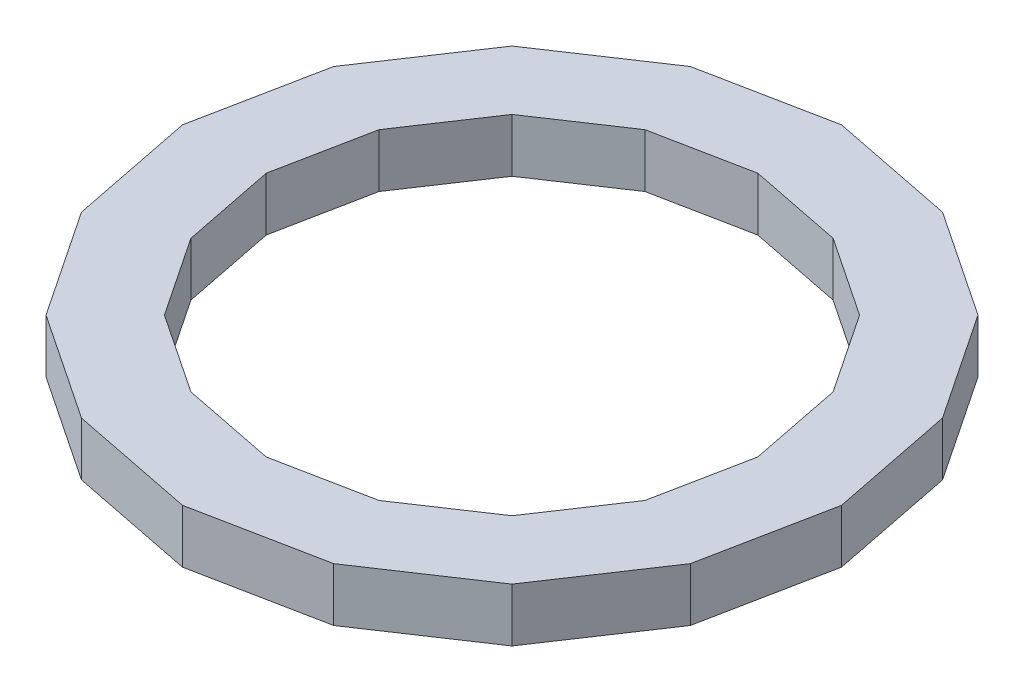
ISO-10303-21;
HEADER;
FILE_DESCRIPTION(('STEP AP214'),'2;1');
FILE_NAME('part.step','',(''),(''),'','','');
FILE_SCHEMA(('AUTOMOTIVE_DESIGN { 1 0 10303 214 1 1 1 1 }'));
ENDSEC;
DATA;
#1=APPLICATION_CONTEXT('core data for automotive mechanical design processes');
#2=APPLICATION_PROTOCOL_DEFINITION('international standard','automotive_design',2000,#1);
#3=PRODUCT_CONTEXT('',#1,'mechanical');
#4=PRODUCT('Part','Part','',(#3));
#5=PRODUCT_RELATED_PRODUCT_CATEGORY('part','',(#4));
#6=PRODUCT_DEFINITION_FORMATION('','',#4);
#7=PRODUCT_DEFINITION_CONTEXT('part definition',#1,'design');
#8=PRODUCT_DEFINITION('design','',#6,#7);
#9=PRODUCT_DEFINITION_SHAPE('','',#8);
#10=(LENGTH_UNIT() NAMED_UNIT(*) SI_UNIT(.MILLI.,.METRE.));
#11=(NAMED_UNIT(*) PLANE_ANGLE_UNIT() SI_UNIT($,.RADIAN.));
#12=(NAMED_UNIT(*) SI_UNIT($,.STERADIAN.) SOLID_ANGLE_UNIT());
#13=UNCERTAINTY_MEASURE_WITH_UNIT(LENGTH_MEASURE(1.E-05),#10,'distance_accuracy_value','');
#14=(GEOMETRIC_REPRESENTATION_CONTEXT(3) GLOBAL_UNCERTAINTY_ASSIGNED_CONTEXT((#13)) GLOBAL_UNIT_ASSIGNED_CONTEXT((#10,
#11,#12)) REPRESENTATION_CONTEXT('',''));
#15=CARTESIAN_POINT('',(0.,0.,0.));
#16=DIRECTION('',(0.,0.,1.));
#17=DIRECTION('',(1.,0.,0.));
#18=AXIS2_PLACEMENT_3D('',#15,#16,#17);
#19=CARTESIAN_POINT('',(0.,19.05,0.));
#20=DIRECTION('',(0.,1.,0.));
#21=DIRECTION('',(0.,0.,1.));
#22=AXIS2_PLACEMENT_3D('',#19,#20,#21);
#23=PLANE('',#22);
#24=DIRECTION('',(0.195090322016118,0.,-0.980785280403233));
#25=VECTOR('',#24,1.);
#26=CARTESIAN_POINT('',(108.256964748165,19.05,44.8415030200346));
#27=LINE('',#26,#25);
#28=CARTESIAN_POINT('',(108.256964748165,19.05,44.8415030200346));
#29=VERTEX_POINT('',#28);
#30=CARTESIAN_POINT('',(117.176494270742,19.05,-1.2836898412475E-12));
#31=VERTEX_POINT('',#30);
#32=EDGE_CURVE('E380',#29,#31,#27,.T.);
#33=ORIENTED_EDGE('',*,*,#32,.T.);
#34=DIRECTION('',(-0.195090322016139,0.,-0.980785280403228));
#35=VECTOR('',#34,1.);
#36=CARTESIAN_POINT('',(117.176494270742,19.05,-1.2836898412475E-12));
#37=LINE('',#36,#35);
#38=CARTESIAN_POINT('',(108.256964748164,19.05,-44.8415030200369));
#39=VERTEX_POINT('',#38);
#40=EDGE_CURVE('E383',#31,#39,#37,.T.);
#41=ORIENTED_EDGE('',*,*,#40,.T.);
#42=DIRECTION('',(-0.555570233019611,0.,-0.831469612302539));
#43=VECTOR('',#42,1.);
#44=CARTESIAN_POINT('',(108.256964748164,19.05,-44.8415030200369));
#45=LINE('',#44,#43);
#46=CARTESIAN_POINT('',(82.8562936945072,19.05,-82.856293694509));
#47=VERTEX_POINT('',#46);
#48=EDGE_CURVE('E386',#39,#47,#45,.T.);
#49=ORIENTED_EDGE('',*,*,#48,.T.);
#50=DIRECTION('',(-0.831469612302551,0.,-0.555570233019593));
#51=VECTOR('',#50,1.);
#52=CARTESIAN_POINT('',(82.8562936945072,19.05,-82.856293694509));
#53=LINE('',#52,#51);
#54=CARTESIAN_POINT('',(44.8415030200347,19.05,-108.256964748165));
#55=VERTEX_POINT('',#54);
#56=EDGE_CURVE('E388',#47,#55,#53,.T.);
#57=ORIENTED_EDGE('',*,*,#56,.T.);
#58=DIRECTION('',(-0.980785280403233,0.,-0.195090322016118));
#59=VECTOR('',#58,1.);
#60=CARTESIAN_POINT('',(44.8415030200347,19.05,-108.256964748165));
#61=LINE('',#60,#59);
#62=CARTESIAN_POINT('',(-1.23500220557387E-12,19.05,-117.176494270742));
#63=VERTEX_POINT('',#62);
#64=EDGE_CURVE('E391',#55,#63,#61,.T.);
#65=ORIENTED_EDGE('',*,*,#64,.T.);
#66=DIRECTION('',(-0.980785280403228,0.,0.195090322016139));
#67=VECTOR('',#66,1.);
#68=CARTESIAN_POINT('',(-1.23500220557387E-12,19.05,-117.176494270742));
#69=LINE('',#68,#67);
#70=CARTESIAN_POINT('',(-44.8415030200369,19.05,-108.256964748164));
#71=VERTEX_POINT('',#70);
#72=EDGE_CURVE('E394',#63,#71,#69,.T.);
#73=ORIENTED_EDGE('',*,*,#72,.T.);
#74=DIRECTION('',(-0.831469612302539,0.,0.555570233019611));
#75=VECTOR('',#74,1.);
#76=CARTESIAN_POINT('',(-44.8415030200369,19.05,-108.256964748164));
#77=LINE('',#76,#75);
#78=CARTESIAN_POINT('',(-82.856293694509,19.05,-82.8562936945072));
#79=VERTEX_POINT('',#78);
#80=EDGE_CURVE('E396',#71,#79,#77,.T.);
#81=ORIENTED_EDGE('',*,*,#80,.T.);
#82=DIRECTION('',(-0.555570233019593,0.,0.831469612302551));
#83=VECTOR('',#82,1.);
#84=CARTESIAN_POINT('',(-82.856293694509,19.05,-82.8562936945072));
#85=LINE('',#84,#83);
#86=CARTESIAN_POINT('',(-108.256964748165,19.05,-44.8415030200345));
#87=VERTEX_POINT('',#86);
#88=EDGE_CURVE('E398',#79,#87,#85,.T.);
#89=ORIENTED_EDGE('',*,*,#88,.T.);
#90=DIRECTION('',(-0.195090322016118,0.,0.980785280403233));
#91=VECTOR('',#90,1.);
#92=CARTESIAN_POINT('',(-108.256964748165,19.05,-44.8415030200345));
#93=LINE('',#92,#91);
#94=CARTESIAN_POINT('',(-117.176494270742,19.05,1.25593425093567E-12));
#95=VERTEX_POINT('',#94);
#96=EDGE_CURVE('E400',#87,#95,#93,.T.);
#97=ORIENTED_EDGE('',*,*,#96,.T.);
#98=DIRECTION('',(0.195090322016139,0.,0.980785280403228));
#99=VECTOR('',#98,1.);
#100=CARTESIAN_POINT('',(-117.176494270742,19.05,1.25593425093567E-12));
#101=LINE('',#100,#99);
#102=CARTESIAN_POINT('',(-108.256964748164,19.05,44.8415030200368));
#103=VERTEX_POINT('',#102);
#104=EDGE_CURVE('E402',#95,#103,#101,.T.);
#105=ORIENTED_EDGE('',*,*,#104,.T.);
#106=DIRECTION('',(0.555570233019611,0.,0.831469612302539));
#107=VECTOR('',#106,1.);
#108=CARTESIAN_POINT('',(-108.256964748164,19.05,44.8415030200368));
#109=LINE('',#108,#107);
#110=CARTESIAN_POINT('',(-82.8562936945072,19.05,82.8562936945089));
#111=VERTEX_POINT('',#110);
#112=EDGE_CURVE('E404',#103,#111,#109,.T.);
#113=ORIENTED_EDGE('',*,*,#112,.T.);
#114=DIRECTION('',(0.831469612302551,0.,0.555570233019594));
#115=VECTOR('',#114,1.);
#116=CARTESIAN_POINT('',(-82.8562936945072,19.05,82.8562936945089));
#117=LINE('',#116,#115);
#118=CARTESIAN_POINT('',(-44.8415030200346,19.05,108.256964748165));
#119=VERTEX_POINT('',#118);
#120=EDGE_CURVE('E406',#111,#119,#117,.T.);
#121=ORIENTED_EDGE('',*,*,#120,.T.);
#122=DIRECTION('',(0.980785280403232,0.,0.195090322016118));
#123=VECTOR('',#122,1.);
#124=CARTESIAN_POINT('',(-44.8415030200346,19.05,108.256964748165));
#125=LINE('',#124,#123);
#126=CARTESIAN_POINT('',(1.2390089246743E-12,19.05,117.176494270742));
#127=VERTEX_POINT('',#126);
#128=EDGE_CURVE('E408',#119,#127,#125,.T.);
#129=ORIENTED_EDGE('',*,*,#128,.T.);
#130=DIRECTION('',(0.980785280403228,0.,-0.195090322016139));
#131=VECTOR('',#130,1.);
#132=CARTESIAN_POINT('',(1.2390089246743E-12,19.05,117.176494270742));
#133=LINE('',#132,#131);
#134=CARTESIAN_POINT('',(44.8415030200369,19.05,108.256964748164));
#135=VERTEX_POINT('',#134);
#136=EDGE_CURVE('E410',#127,#135,#133,.T.);
#137=ORIENTED_EDGE('',*,*,#136,.T.);
#138=DIRECTION('',(0.831469612302539,0.,-0.555570233019611));
#139=VECTOR('',#138,1.);
#140=CARTESIAN_POINT('',(44.8415030200369,19.05,108.256964748164));
#141=LINE('',#140,#139);
#142=CARTESIAN_POINT('',(82.8562936945089,19.05,82.8562936945072));
#143=VERTEX_POINT('',#142);
#144=EDGE_CURVE('E412',#135,#143,#141,.T.);
#145=ORIENTED_EDGE('',*,*,#144,.T.);
#146=DIRECTION('',(0.555570233019593,0.,-0.831469612302551));
#147=VECTOR('',#146,1.);
#148=CARTESIAN_POINT('',(82.8562936945089,19.05,82.8562936945072));
#149=LINE('',#148,#147);
#150=EDGE_CURVE('E414',#143,#29,#149,.T.);
#151=ORIENTED_EDGE('',*,*,#150,.T.);
#152=EDGE_LOOP('',(#33,#41,#49,#57,#65,#73,#81,#89,#97,#105,#113,#121,#129,#137,#145,#151));
#153=FACE_BOUND('',#152,.T.);
#154=DIRECTION('',(-0.195090322016139,0.,-0.980785280403228));
#155=VECTOR('',#154,1.);
#156=CARTESIAN_POINT('',(87.3942365394767,19.05,-9.61078683792279E-13));
#157=LINE('',#156,#155);
#158=CARTESIAN_POINT('',(87.3942365394767,19.05,-9.61078683792279E-13));
#159=VERTEX_POINT('',#158);
#160=CARTESIAN_POINT('',(80.7417463982722,19.05,-33.4443264078544));
#161=VERTEX_POINT('',#160);
#162=EDGE_CURVE('E252',#159,#161,#157,.T.);
#163=ORIENTED_EDGE('',*,*,#162,.F.);
#164=DIRECTION('',(0.195090322016117,0.,-0.980785280403233));
#165=VECTOR('',#164,1.);
#166=CARTESIAN_POINT('',(80.741746398273,19.05,33.4443264078526));
#167=LINE('',#166,#165);
#168=CARTESIAN_POINT('',(80.741746398273,19.05,33.4443264078526));
#169=VERTEX_POINT('',#168);
#170=EDGE_CURVE('E244',#169,#159,#167,.T.);
#171=ORIENTED_EDGE('',*,*,#170,.F.);
#172=DIRECTION('',(0.555570233019594,0.,-0.831469612302551));
#173=VECTOR('',#172,1.);
#174=CARTESIAN_POINT('',(61.7970572936858,19.05,61.7970572936845));
#175=LINE('',#174,#173);
#176=CARTESIAN_POINT('',(61.7970572936858,19.05,61.7970572936845));
#177=VERTEX_POINT('',#176);
#178=EDGE_CURVE('E301',#177,#169,#175,.T.);
#179=ORIENTED_EDGE('',*,*,#178,.F.);
#180=DIRECTION('',(0.831469612302539,0.,-0.555570233019611));
#181=VECTOR('',#180,1.);
#182=CARTESIAN_POINT('',(33.4443264078544,19.05,80.7417463982722));
#183=LINE('',#182,#181);
#184=CARTESIAN_POINT('',(33.4443264078544,19.05,80.7417463982722));
#185=VERTEX_POINT('',#184);
#186=EDGE_CURVE('E298',#185,#177,#183,.T.);
#187=ORIENTED_EDGE('',*,*,#186,.F.);
#188=DIRECTION('',(0.980785280403228,0.,-0.195090322016139));
#189=VECTOR('',#188,1.);
#190=CARTESIAN_POINT('',(9.47666460703789E-13,19.05,87.3942365394767));
#191=LINE('',#190,#189);
#192=CARTESIAN_POINT('',(9.47666460703789E-13,19.05,87.3942365394767));
#193=VERTEX_POINT('',#192);
#194=EDGE_CURVE('E296',#193,#185,#191,.T.);
#195=ORIENTED_EDGE('',*,*,#194,.F.);
#196=DIRECTION('',(0.980785280403232,0.,0.195090322016118));
#197=VECTOR('',#196,1.);
#198=CARTESIAN_POINT('',(-33.4443264078526,19.05,80.7417463982729));
#199=LINE('',#198,#197);
#200=CARTESIAN_POINT('',(-33.4443264078526,19.05,80.7417463982729));
#201=VERTEX_POINT('',#200);
#202=EDGE_CURVE('E294',#201,#193,#199,.T.);
#203=ORIENTED_EDGE('',*,*,#202,.F.);
#204=DIRECTION('',(0.831469612302551,0.,0.555570233019593));
#205=VECTOR('',#204,1.);
#206=CARTESIAN_POINT('',(-61.7970572936845,19.05,61.7970572936858));
#207=LINE('',#206,#205);
#208=CARTESIAN_POINT('',(-61.7970572936845,19.05,61.7970572936858));
#209=VERTEX_POINT('',#208);
#210=EDGE_CURVE('E291',#209,#201,#207,.T.);
#211=ORIENTED_EDGE('',*,*,#210,.F.);
#212=DIRECTION('',(0.555570233019611,0.,0.831469612302539));
#213=VECTOR('',#212,1.);
#214=CARTESIAN_POINT('',(-80.7417463982722,19.05,33.4443264078543));
#215=LINE('',#214,#213);
#216=CARTESIAN_POINT('',(-80.7417463982722,19.05,33.4443264078543));
#217=VERTEX_POINT('',#216);
#218=EDGE_CURVE('E289',#217,#209,#215,.T.);
#219=ORIENTED_EDGE('',*,*,#218,.F.);
#220=DIRECTION('',(0.195090322016139,0.,0.980785280403228));
#221=VECTOR('',#220,1.);
#222=CARTESIAN_POINT('',(-87.3942365394767,19.05,9.88661870301204E-13));
#223=LINE('',#222,#221);
#224=CARTESIAN_POINT('',(-87.3942365394767,19.05,9.88661870301204E-13));
#225=VERTEX_POINT('',#224);
#226=EDGE_CURVE('E287',#225,#217,#223,.T.);
#227=ORIENTED_EDGE('',*,*,#226,.F.);
#228=DIRECTION('',(-0.195090322016118,0.,0.980785280403232));
#229=VECTOR('',#228,1.);
#230=CARTESIAN_POINT('',(-80.741746398273,19.05,-33.4443264078526));
#231=LINE('',#230,#229);
#232=CARTESIAN_POINT('',(-80.741746398273,19.05,-33.4443264078526));
#233=VERTEX_POINT('',#232);
#234=EDGE_CURVE('E285',#233,#225,#231,.T.);
#235=ORIENTED_EDGE('',*,*,#234,.F.);
#236=DIRECTION('',(-0.555570233019593,0.,0.831469612302551));
#237=VECTOR('',#236,1.);
#238=CARTESIAN_POINT('',(-61.7970572936858,19.05,-61.7970572936845));
#239=LINE('',#238,#237);
#240=CARTESIAN_POINT('',(-61.7970572936858,19.05,-61.7970572936845));
#241=VERTEX_POINT('',#240);
#242=EDGE_CURVE('E283',#241,#233,#239,.T.);
#243=ORIENTED_EDGE('',*,*,#242,.F.);
#244=DIRECTION('',(-0.831469612302539,0.,0.555570233019611));
#245=VECTOR('',#244,1.);
#246=CARTESIAN_POINT('',(-33.4443264078544,19.05,-80.7417463982722));
#247=LINE('',#246,#245);
#248=CARTESIAN_POINT('',(-33.4443264078544,19.05,-80.7417463982722));
#249=VERTEX_POINT('',#248);
#250=EDGE_CURVE('E281',#249,#241,#247,.T.);
#251=ORIENTED_EDGE('',*,*,#250,.F.);
#252=DIRECTION('',(-0.980785280403228,0.,0.195090322016139));
#253=VECTOR('',#252,1.);
#254=CARTESIAN_POINT('',(-9.54194750042065E-13,19.05,-87.3942365394767));
#255=LINE('',#254,#253);
#256=CARTESIAN_POINT('',(-9.54194750042065E-13,19.05,-87.3942365394767));
#257=VERTEX_POINT('',#256);
#258=EDGE_CURVE('E279',#257,#249,#255,.T.);
#259=ORIENTED_EDGE('',*,*,#258,.F.);
#260=DIRECTION('',(-0.980785280403232,0.,-0.195090322016118));
#261=VECTOR('',#260,1.);
#262=CARTESIAN_POINT('',(33.4443264078526,19.05,-80.741746398273));
#263=LINE('',#262,#261);
#264=CARTESIAN_POINT('',(33.4443264078526,19.05,-80.741746398273));
#265=VERTEX_POINT('',#264);
#266=EDGE_CURVE('E276',#265,#257,#263,.T.);
#267=ORIENTED_EDGE('',*,*,#266,.F.);
#268=DIRECTION('',(-0.831469612302551,0.,-0.555570233019593));
#269=VECTOR('',#268,1.);
#270=CARTESIAN_POINT('',(61.7970572936845,19.05,-61.7970572936858));
#271=LINE('',#270,#269);
#272=CARTESIAN_POINT('',(61.7970572936845,19.05,-61.7970572936858));
#273=VERTEX_POINT('',#272);
#274=EDGE_CURVE('E271',#273,#265,#271,.T.);
#275=ORIENTED_EDGE('',*,*,#274,.F.);
#276=DIRECTION('',(-0.555570233019611,0.,-0.831469612302539));
#277=VECTOR('',#276,1.);
#278=CARTESIAN_POINT('',(80.7417463982722,19.05,-33.4443264078544));
#279=LINE('',#278,#277);
#280=EDGE_CURVE('E265',#161,#273,#279,.T.);
#281=ORIENTED_EDGE('',*,*,#280,.F.);
#282=EDGE_LOOP('',(#163,#171,#179,#187,#195,#203,#211,#219,#227,#235,#243,#251,#259,#267,#275,#281));
#283=FACE_BOUND('',#282,.T.);
#284=ADVANCED_FACE('F35',(#153,#283),#23,.T.);
#285=CARTESIAN_POINT('',(0.,0.,0.));
#286=DIRECTION('',(0.,1.,0.));
#287=DIRECTION('',(0.,0.,1.));
#288=AXIS2_PLACEMENT_3D('',#285,#286,#287);
#289=PLANE('',#288);
#290=DIRECTION('',(0.195090322016118,0.,-0.980785280403233));
#291=VECTOR('',#290,1.);
#292=CARTESIAN_POINT('',(108.256964748165,0.,44.8415030200346));
#293=LINE('',#292,#291);
#294=CARTESIAN_POINT('',(108.256964748165,0.,44.8415030200346));
#295=VERTEX_POINT('',#294);
#296=CARTESIAN_POINT('',(117.176494270742,0.,-1.2836898412475E-12));
#297=VERTEX_POINT('',#296);
#298=EDGE_CURVE('E260',#295,#297,#293,.T.);
#299=ORIENTED_EDGE('',*,*,#298,.F.);
#300=DIRECTION('',(0.555570233019593,0.,-0.831469612302551));
#301=VECTOR('',#300,1.);
#302=CARTESIAN_POINT('',(82.8562936945089,0.,82.8562936945072));
#303=LINE('',#302,#301);
#304=CARTESIAN_POINT('',(82.8562936945089,0.,82.8562936945072));
#305=VERTEX_POINT('',#304);
#306=EDGE_CURVE('E384',#305,#295,#303,.T.);
#307=ORIENTED_EDGE('',*,*,#306,.F.);
#308=DIRECTION('',(0.831469612302539,0.,-0.555570233019611));
#309=VECTOR('',#308,1.);
#310=CARTESIAN_POINT('',(44.8415030200369,0.,108.256964748164));
#311=LINE('',#310,#309);
#312=CARTESIAN_POINT('',(44.8415030200369,0.,108.256964748164));
#313=VERTEX_POINT('',#312);
#314=EDGE_CURVE('E447',#313,#305,#311,.T.);
#315=ORIENTED_EDGE('',*,*,#314,.F.);
#316=DIRECTION('',(0.980785280403228,0.,-0.195090322016139));
#317=VECTOR('',#316,1.);
#318=CARTESIAN_POINT('',(1.2390089246743E-12,0.,117.176494270742));
#319=LINE('',#318,#317);
#320=CARTESIAN_POINT('',(1.2390089246743E-12,0.,117.176494270742));
#321=VERTEX_POINT('',#320);
#322=EDGE_CURVE('E445',#321,#313,#319,.T.);
#323=ORIENTED_EDGE('',*,*,#322,.F.);
#324=DIRECTION('',(0.980785280403232,0.,0.195090322016118));
#325=VECTOR('',#324,1.);
#326=CARTESIAN_POINT('',(-44.8415030200346,0.,108.256964748165));
#327=LINE('',#326,#325);
#328=CARTESIAN_POINT('',(-44.8415030200346,0.,108.256964748165));
#329=VERTEX_POINT('',#328);
#330=EDGE_CURVE('E443',#329,#321,#327,.T.);
#331=ORIENTED_EDGE('',*,*,#330,.F.);
#332=DIRECTION('',(0.831469612302551,0.,0.555570233019594));
#333=VECTOR('',#332,1.);
#334=CARTESIAN_POINT('',(-82.8562936945072,0.,82.8562936945089));
#335=LINE('',#334,#333);
#336=CARTESIAN_POINT('',(-82.8562936945072,0.,82.8562936945089));
#337=VERTEX_POINT('',#336);
#338=EDGE_CURVE('E441',#337,#329,#335,.T.);
#339=ORIENTED_EDGE('',*,*,#338,.F.);
#340=DIRECTION('',(0.555570233019611,0.,0.831469612302539));
#341=VECTOR('',#340,1.);
#342=CARTESIAN_POINT('',(-108.256964748164,0.,44.8415030200368));
#343=LINE('',#342,#341);
#344=CARTESIAN_POINT('',(-108.256964748164,0.,44.8415030200368));
#345=VERTEX_POINT('',#344);
#346=EDGE_CURVE('E439',#345,#337,#343,.T.);
#347=ORIENTED_EDGE('',*,*,#346,.F.);
#348=DIRECTION('',(0.195090322016139,0.,0.980785280403228));
#349=VECTOR('',#348,1.);
#350=CARTESIAN_POINT('',(-117.176494270742,0.,1.25593425093567E-12));
#351=LINE('',#350,#349);
#352=CARTESIAN_POINT('',(-117.176494270742,0.,1.25593425093567E-12));
#353=VERTEX_POINT('',#352);
#354=EDGE_CURVE('E437',#353,#345,#351,.T.);
#355=ORIENTED_EDGE('',*,*,#354,.F.);
#356=DIRECTION('',(-0.195090322016118,0.,0.980785280403233));
#357=VECTOR('',#356,1.);
#358=CARTESIAN_POINT('',(-108.256964748165,0.,-44.8415030200345));
#359=LINE('',#358,#357);
#360=CARTESIAN_POINT('',(-108.256964748165,0.,-44.8415030200345));
#361=VERTEX_POINT('',#360);
#362=EDGE_CURVE('E434',#361,#353,#359,.T.);
#363=ORIENTED_EDGE('',*,*,#362,.F.);
#364=DIRECTION('',(-0.555570233019593,0.,0.831469612302551));
#365=VECTOR('',#364,1.);
#366=CARTESIAN_POINT('',(-82.856293694509,0.,-82.8562936945072));
#367=LINE('',#366,#365);
#368=CARTESIAN_POINT('',(-82.856293694509,0.,-82.8562936945072));
#369=VERTEX_POINT('',#368);
#370=EDGE_CURVE('E432',#369,#361,#367,.T.);
#371=ORIENTED_EDGE('',*,*,#370,.F.);
#372=DIRECTION('',(-0.831469612302539,0.,0.555570233019611));
#373=VECTOR('',#372,1.);
#374=CARTESIAN_POINT('',(-44.8415030200369,0.,-108.256964748164));
#375=LINE('',#374,#373);
#376=CARTESIAN_POINT('',(-44.8415030200369,0.,-108.256964748164));
#377=VERTEX_POINT('',#376);
#378=EDGE_CURVE('E430',#377,#369,#375,.T.);
#379=ORIENTED_EDGE('',*,*,#378,.F.);
#380=DIRECTION('',(-0.980785280403228,0.,0.195090322016139));
#381=VECTOR('',#380,1.);
#382=CARTESIAN_POINT('',(-1.23500220557387E-12,0.,-117.176494270742));
#383=LINE('',#382,#381);
#384=CARTESIAN_POINT('',(-1.23500220557387E-12,0.,-117.176494270742));
#385=VERTEX_POINT('',#384);
#386=EDGE_CURVE('E428',#385,#377,#383,.T.);
#387=ORIENTED_EDGE('',*,*,#386,.F.);
#388=DIRECTION('',(-0.980785280403233,0.,-0.195090322016118));
#389=VECTOR('',#388,1.);
#390=CARTESIAN_POINT('',(44.8415030200347,0.,-108.256964748165));
#391=LINE('',#390,#389);
#392=CARTESIAN_POINT('',(44.8415030200347,0.,-108.256964748165));
#393=VERTEX_POINT('',#392);
#394=EDGE_CURVE('E426',#393,#385,#391,.T.);
#395=ORIENTED_EDGE('',*,*,#394,.F.);
#396=DIRECTION('',(-0.831469612302551,0.,-0.555570233019593));
#397=VECTOR('',#396,1.);
#398=CARTESIAN_POINT('',(82.8562936945072,0.,-82.856293694509));
#399=LINE('',#398,#397);
#400=CARTESIAN_POINT('',(82.8562936945072,0.,-82.856293694509));
#401=VERTEX_POINT('',#400);
#402=EDGE_CURVE('E423',#401,#393,#399,.T.);
#403=ORIENTED_EDGE('',*,*,#402,.F.);
#404=DIRECTION('',(-0.555570233019611,0.,-0.831469612302539));
#405=VECTOR('',#404,1.);
#406=CARTESIAN_POINT('',(108.256964748164,0.,-44.8415030200369));
#407=LINE('',#406,#405);
#408=CARTESIAN_POINT('',(108.256964748164,0.,-44.8415030200369));
#409=VERTEX_POINT('',#408);
#410=EDGE_CURVE('E421',#409,#401,#407,.T.);
#411=ORIENTED_EDGE('',*,*,#410,.F.);
#412=DIRECTION('',(-0.195090322016139,0.,-0.980785280403228));
#413=VECTOR('',#412,1.);
#414=CARTESIAN_POINT('',(117.176494270742,0.,-1.2836898412475E-12));
#415=LINE('',#414,#413);
#416=EDGE_CURVE('E419',#297,#409,#415,.T.);
#417=ORIENTED_EDGE('',*,*,#416,.F.);
#418=EDGE_LOOP('',(#299,#307,#315,#323,#331,#339,#347,#355,#363,#371,#379,#387,#395,#403,#411,#417));
#419=FACE_BOUND('',#418,.T.);
#420=DIRECTION('',(0.195090322016117,0.,-0.980785280403233));
#421=VECTOR('',#420,1.);
#422=CARTESIAN_POINT('',(80.741746398273,0.,33.4443264078526));
#423=LINE('',#422,#421);
#424=CARTESIAN_POINT('',(80.741746398273,0.,33.4443264078526));
#425=VERTEX_POINT('',#424);
#426=CARTESIAN_POINT('',(87.3942365394767,0.,-9.61078683792279E-13));
#427=VERTEX_POINT('',#426);
#428=EDGE_CURVE('E58',#425,#427,#423,.T.);
#429=ORIENTED_EDGE('',*,*,#428,.T.);
#430=DIRECTION('',(-0.195090322016139,0.,-0.980785280403228));
#431=VECTOR('',#430,1.);
#432=CARTESIAN_POINT('',(87.3942365394767,0.,-9.61078683792279E-13));
#433=LINE('',#432,#431);
#434=CARTESIAN_POINT('',(80.7417463982722,0.,-33.4443264078544));
#435=VERTEX_POINT('',#434);
#436=EDGE_CURVE('E259',#427,#435,#433,.T.);
#437=ORIENTED_EDGE('',*,*,#436,.T.);
#438=DIRECTION('',(-0.555570233019611,0.,-0.831469612302539));
#439=VECTOR('',#438,1.);
#440=CARTESIAN_POINT('',(80.7417463982722,0.,-33.4443264078544));
#441=LINE('',#440,#439);
#442=CARTESIAN_POINT('',(61.7970572936845,0.,-61.7970572936858));
#443=VERTEX_POINT('',#442);
#444=EDGE_CURVE('E306',#435,#443,#441,.T.);
#445=ORIENTED_EDGE('',*,*,#444,.T.);
#446=DIRECTION('',(-0.831469612302551,0.,-0.555570233019593));
#447=VECTOR('',#446,1.);
#448=CARTESIAN_POINT('',(61.7970572936845,0.,-61.7970572936858));
#449=LINE('',#448,#447);
#450=CARTESIAN_POINT('',(33.4443264078526,0.,-80.741746398273));
#451=VERTEX_POINT('',#450);
#452=EDGE_CURVE('E309',#443,#451,#449,.T.);
#453=ORIENTED_EDGE('',*,*,#452,.T.);
#454=DIRECTION('',(-0.980785280403232,0.,-0.195090322016118));
#455=VECTOR('',#454,1.);
#456=CARTESIAN_POINT('',(33.4443264078526,0.,-80.741746398273));
#457=LINE('',#456,#455);
#458=CARTESIAN_POINT('',(-9.54194750042065E-13,0.,-87.3942365394767));
#459=VERTEX_POINT('',#458);
#460=EDGE_CURVE('E313',#451,#459,#457,.T.);
#461=ORIENTED_EDGE('',*,*,#460,.T.);
#462=DIRECTION('',(-0.980785280403228,0.,0.195090322016139));
#463=VECTOR('',#462,1.);
#464=CARTESIAN_POINT('',(-9.54194750042065E-13,0.,-87.3942365394767));
#465=LINE('',#464,#463);
#466=CARTESIAN_POINT('',(-33.4443264078544,0.,-80.7417463982722));
#467=VERTEX_POINT('',#466);
#468=EDGE_CURVE('E316',#459,#467,#465,.T.);
#469=ORIENTED_EDGE('',*,*,#468,.T.);
#470=DIRECTION('',(-0.831469612302539,0.,0.555570233019611));
#471=VECTOR('',#470,1.);
#472=CARTESIAN_POINT('',(-33.4443264078544,0.,-80.7417463982722));
#473=LINE('',#472,#471);
#474=CARTESIAN_POINT('',(-61.7970572936858,0.,-61.7970572936845));
#475=VERTEX_POINT('',#474);
#476=EDGE_CURVE('E319',#467,#475,#473,.T.);
#477=ORIENTED_EDGE('',*,*,#476,.T.);
#478=DIRECTION('',(-0.555570233019593,0.,0.831469612302551));
#479=VECTOR('',#478,1.);
#480=CARTESIAN_POINT('',(-61.7970572936858,0.,-61.7970572936845));
#481=LINE('',#480,#479);
#482=CARTESIAN_POINT('',(-80.741746398273,0.,-33.4443264078526));
#483=VERTEX_POINT('',#482);
#484=EDGE_CURVE('E323',#475,#483,#481,.T.);
#485=ORIENTED_EDGE('',*,*,#484,.T.);
#486=DIRECTION('',(-0.195090322016118,0.,0.980785280403232));
#487=VECTOR('',#486,1.);
#488=CARTESIAN_POINT('',(-80.741746398273,0.,-33.4443264078526));
#489=LINE('',#488,#487);
#490=CARTESIAN_POINT('',(-87.3942365394767,0.,9.88661870301204E-13));
#491=VERTEX_POINT('',#490);
#492=EDGE_CURVE('E327',#483,#491,#489,.T.);
#493=ORIENTED_EDGE('',*,*,#492,.T.);
#494=DIRECTION('',(0.195090322016139,0.,0.980785280403228));
#495=VECTOR('',#494,1.);
#496=CARTESIAN_POINT('',(-87.3942365394767,0.,9.88661870301204E-13));
#497=LINE('',#496,#495);
#498=CARTESIAN_POINT('',(-80.7417463982722,0.,33.4443264078543));
#499=VERTEX_POINT('',#498);
#500=EDGE_CURVE('E330',#491,#499,#497,.T.);
#501=ORIENTED_EDGE('',*,*,#500,.T.);
#502=DIRECTION('',(0.555570233019611,0.,0.831469612302539));
#503=VECTOR('',#502,1.);
#504=CARTESIAN_POINT('',(-80.7417463982722,0.,33.4443264078543));
#505=LINE('',#504,#503);
#506=CARTESIAN_POINT('',(-61.7970572936845,0.,61.7970572936858));
#507=VERTEX_POINT('',#506);
#508=EDGE_CURVE('E333',#499,#507,#505,.T.);
#509=ORIENTED_EDGE('',*,*,#508,.T.);
#510=DIRECTION('',(0.831469612302551,0.,0.555570233019593));
#511=VECTOR('',#510,1.);
#512=CARTESIAN_POINT('',(-61.7970572936845,0.,61.7970572936858));
#513=LINE('',#512,#511);
#514=CARTESIAN_POINT('',(-33.4443264078526,0.,80.7417463982729));
#515=VERTEX_POINT('',#514);
#516=EDGE_CURVE('E337',#507,#515,#513,.T.);
#517=ORIENTED_EDGE('',*,*,#516,.T.);
#518=DIRECTION('',(0.980785280403232,0.,0.195090322016118));
#519=VECTOR('',#518,1.);
#520=CARTESIAN_POINT('',(-33.4443264078526,0.,80.7417463982729));
#521=LINE('',#520,#519);
#522=CARTESIAN_POINT('',(9.47666460703789E-13,0.,87.3942365394767));
#523=VERTEX_POINT('',#522);
#524=EDGE_CURVE('E340',#515,#523,#521,.T.);
#525=ORIENTED_EDGE('',*,*,#524,.T.);
#526=DIRECTION('',(0.980785280403228,0.,-0.195090322016139));
#527=VECTOR('',#526,1.);
#528=CARTESIAN_POINT('',(9.47666460703789E-13,0.,87.3942365394767));
#529=LINE('',#528,#527);
#530=CARTESIAN_POINT('',(33.4443264078544,0.,80.7417463982722));
#531=VERTEX_POINT('',#530);
#532=EDGE_CURVE('E343',#523,#531,#529,.T.);
#533=ORIENTED_EDGE('',*,*,#532,.T.);
#534=DIRECTION('',(0.831469612302539,0.,-0.555570233019611));
#535=VECTOR('',#534,1.);
#536=CARTESIAN_POINT('',(33.4443264078544,0.,80.7417463982722));
#537=LINE('',#536,#535);
#538=CARTESIAN_POINT('',(61.7970572936858,0.,61.7970572936845));
#539=VERTEX_POINT('',#538);
#540=EDGE_CURVE('E346',#531,#539,#537,.T.);
#541=ORIENTED_EDGE('',*,*,#540,.T.);
#542=DIRECTION('',(0.555570233019594,0.,-0.831469612302551));
#543=VECTOR('',#542,1.);
#544=CARTESIAN_POINT('',(61.7970572936858,0.,61.7970572936845));
#545=LINE('',#544,#543);
#546=EDGE_CURVE('E253',#539,#425,#545,.T.);
#547=ORIENTED_EDGE('',*,*,#546,.T.);
#548=EDGE_LOOP('',(#429,#437,#445,#453,#461,#469,#477,#485,#493,#501,#509,#517,#525,#533,#541,#547));
#549=FACE_BOUND('',#548,.T.);
#550=ADVANCED_FACE('F506',(#419,#549),#289,.F.);
#551=CARTESIAN_POINT('',(108.256964748165,19.05,44.8415030200346));
#552=DIRECTION('',(-0.980785280403232,0.,-0.195090322016118));
#553=DIRECTION('',(-0.195090322016118,0.,0.980785280403233));
#554=AXIS2_PLACEMENT_3D('',#551,#552,#553);
#555=PLANE('',#554);
#556=ORIENTED_EDGE('',*,*,#298,.T.);
#557=DIRECTION('',(0.,-1.,0.));
#558=VECTOR('',#557,1.);
#559=CARTESIAN_POINT('',(117.176494270742,19.05,-1.2836898412475E-12));
#560=LINE('',#559,#558);
#561=EDGE_CURVE('E11',#31,#297,#560,.T.);
#562=ORIENTED_EDGE('',*,*,#561,.F.);
#563=ORIENTED_EDGE('',*,*,#32,.F.);
#564=DIRECTION('',(0.,-1.,0.));
#565=VECTOR('',#564,1.);
#566=CARTESIAN_POINT('',(108.256964748165,19.05,44.8415030200346));
#567=LINE('',#566,#565);
#568=EDGE_CURVE('E416',#29,#295,#567,.T.);
#569=ORIENTED_EDGE('',*,*,#568,.T.);
#570=EDGE_LOOP('',(#556,#562,#563,#569));
#571=FACE_BOUND('',#570,.T.);
#572=ADVANCED_FACE('F37',(#571),#555,.F.);
#573=CARTESIAN_POINT('',(117.176494270742,19.05,-1.2836898412475E-12));
#574=DIRECTION('',(-0.980785280403228,0.,0.195090322016139));
#575=DIRECTION('',(0.195090322016139,0.,0.980785280403228));
#576=AXIS2_PLACEMENT_3D('',#573,#574,#575);
#577=PLANE('',#576);
#578=ORIENTED_EDGE('',*,*,#416,.T.);
#579=DIRECTION('',(0.,-1.,0.));
#580=VECTOR('',#579,1.);
#581=CARTESIAN_POINT('',(108.256964748164,19.05,-44.8415030200369));
#582=LINE('',#581,#580);
#583=EDGE_CURVE('E43',#39,#409,#582,.T.);
#584=ORIENTED_EDGE('',*,*,#583,.F.);
#585=ORIENTED_EDGE('',*,*,#40,.F.);
#586=ORIENTED_EDGE('',*,*,#561,.T.);
#587=EDGE_LOOP('',(#578,#584,#585,#586));
#588=FACE_BOUND('',#587,.T.);
#589=ADVANCED_FACE('F523',(#588),#577,.F.);
#590=CARTESIAN_POINT('',(108.256964748164,19.05,-44.8415030200369));
#591=DIRECTION('',(-0.831469612302539,0.,0.555570233019611));
#592=DIRECTION('',(0.555570233019611,0.,0.831469612302539));
#593=AXIS2_PLACEMENT_3D('',#590,#591,#592);
#594=PLANE('',#593);
#595=ORIENTED_EDGE('',*,*,#410,.T.);
#596=DIRECTION('',(0.,-1.,0.));
#597=VECTOR('',#596,1.);
#598=CARTESIAN_POINT('',(82.8562936945072,19.05,-82.856293694509));
#599=LINE('',#598,#597);
#600=EDGE_CURVE('E489',#47,#401,#599,.T.);
#601=ORIENTED_EDGE('',*,*,#600,.F.);
#602=ORIENTED_EDGE('',*,*,#48,.F.);
#603=ORIENTED_EDGE('',*,*,#583,.T.);
#604=EDGE_LOOP('',(#595,#601,#602,#603));
#605=FACE_BOUND('',#604,.T.);
#606=ADVANCED_FACE('F500',(#605),#594,.F.);
#607=CARTESIAN_POINT('',(82.8562936945072,19.05,-82.856293694509));
#608=DIRECTION('',(-0.555570233019593,0.,0.831469612302551));
#609=DIRECTION('',(0.831469612302551,0.,0.555570233019593));
#610=AXIS2_PLACEMENT_3D('',#607,#608,#609);
#611=PLANE('',#610);
#612=ORIENTED_EDGE('',*,*,#402,.T.);
#613=DIRECTION('',(0.,-1.,0.));
#614=VECTOR('',#613,1.);
#615=CARTESIAN_POINT('',(44.8415030200347,19.05,-108.256964748165));
#616=LINE('',#615,#614);
#617=EDGE_CURVE('E486',#55,#393,#616,.T.);
#618=ORIENTED_EDGE('',*,*,#617,.F.);
#619=ORIENTED_EDGE('',*,*,#56,.F.);
#620=ORIENTED_EDGE('',*,*,#600,.T.);
#621=EDGE_LOOP('',(#612,#618,#619,#620));
#622=FACE_BOUND('',#621,.T.);
#623=ADVANCED_FACE('F512',(#622),#611,.F.);
#624=CARTESIAN_POINT('',(44.8415030200347,19.05,-108.256964748165));
#625=DIRECTION('',(-0.195090322016118,0.,0.980785280403233));
#626=DIRECTION('',(0.980785280403233,0.,0.195090322016118));
#627=AXIS2_PLACEMENT_3D('',#624,#625,#626);
#628=PLANE('',#627);
#629=ORIENTED_EDGE('',*,*,#394,.T.);
#630=DIRECTION('',(0.,-1.,0.));
#631=VECTOR('',#630,1.);
#632=CARTESIAN_POINT('',(-1.23500220557387E-12,19.05,-117.176494270742));
#633=LINE('',#632,#631);
#634=EDGE_CURVE('E483',#63,#385,#633,.T.);
#635=ORIENTED_EDGE('',*,*,#634,.F.);
#636=ORIENTED_EDGE('',*,*,#64,.F.);
#637=ORIENTED_EDGE('',*,*,#617,.T.);
#638=EDGE_LOOP('',(#629,#635,#636,#637));
#639=FACE_BOUND('',#638,.T.);
#640=ADVANCED_FACE('F516',(#639),#628,.F.);
#641=CARTESIAN_POINT('',(-1.23500220557387E-12,19.05,-117.176494270742));
#642=DIRECTION('',(0.195090322016139,0.,0.980785280403228));
#643=DIRECTION('',(0.980785280403229,0.,-0.195090322016139));
#644=AXIS2_PLACEMENT_3D('',#641,#642,#643);
#645=PLANE('',#644);
#646=ORIENTED_EDGE('',*,*,#386,.T.);
#647=DIRECTION('',(0.,-1.,0.));
#648=VECTOR('',#647,1.);
#649=CARTESIAN_POINT('',(-44.8415030200369,19.05,-108.256964748164));
#650=LINE('',#649,#648);
#651=EDGE_CURVE('E480',#71,#377,#650,.T.);
#652=ORIENTED_EDGE('',*,*,#651,.F.);
#653=ORIENTED_EDGE('',*,*,#72,.F.);
#654=ORIENTED_EDGE('',*,*,#634,.T.);
#655=EDGE_LOOP('',(#646,#652,#653,#654));
#656=FACE_BOUND('',#655,.T.);
#657=ADVANCED_FACE('F576',(#656),#645,.F.);
#658=CARTESIAN_POINT('',(-44.8415030200369,19.05,-108.256964748164));
#659=DIRECTION('',(0.555570233019611,0.,0.831469612302539));
#660=DIRECTION('',(0.831469612302539,0.,-0.555570233019611));
#661=AXIS2_PLACEMENT_3D('',#658,#659,#660);
#662=PLANE('',#661);
#663=ORIENTED_EDGE('',*,*,#378,.T.);
#664=DIRECTION('',(0.,-1.,0.));
#665=VECTOR('',#664,1.);
#666=CARTESIAN_POINT('',(-82.856293694509,19.05,-82.8562936945072));
#667=LINE('',#666,#665);
#668=EDGE_CURVE('E477',#79,#369,#667,.T.);
#669=ORIENTED_EDGE('',*,*,#668,.F.);
#670=ORIENTED_EDGE('',*,*,#80,.F.);
#671=ORIENTED_EDGE('',*,*,#651,.T.);
#672=EDGE_LOOP('',(#663,#669,#670,#671));
#673=FACE_BOUND('',#672,.T.);
#674=ADVANCED_FACE('F573',(#673),#662,.F.);
#675=CARTESIAN_POINT('',(-82.856293694509,19.05,-82.8562936945072));
#676=DIRECTION('',(0.831469612302551,0.,0.555570233019593));
#677=DIRECTION('',(0.555570233019593,0.,-0.831469612302551));
#678=AXIS2_PLACEMENT_3D('',#675,#676,#677);
#679=PLANE('',#678);
#680=ORIENTED_EDGE('',*,*,#370,.T.);
#681=DIRECTION('',(0.,-1.,0.));
#682=VECTOR('',#681,1.);
#683=CARTESIAN_POINT('',(-108.256964748165,19.05,-44.8415030200345));
#684=LINE('',#683,#682);
#685=EDGE_CURVE('E474',#87,#361,#684,.T.);
#686=ORIENTED_EDGE('',*,*,#685,.F.);
#687=ORIENTED_EDGE('',*,*,#88,.F.);
#688=ORIENTED_EDGE('',*,*,#668,.T.);
#689=EDGE_LOOP('',(#680,#686,#687,#688));
#690=FACE_BOUND('',#689,.T.);
#691=ADVANCED_FACE('F569',(#690),#679,.F.);
#692=CARTESIAN_POINT('',(-108.256964748165,19.05,-44.8415030200345));
#693=DIRECTION('',(0.980785280403233,0.,0.195090322016118));
#694=DIRECTION('',(0.195090322016118,0.,-0.980785280403233));
#695=AXIS2_PLACEMENT_3D('',#692,#693,#694);
#696=PLANE('',#695);
#697=ORIENTED_EDGE('',*,*,#362,.T.);
#698=DIRECTION('',(0.,-1.,0.));
#699=VECTOR('',#698,1.);
#700=CARTESIAN_POINT('',(-117.176494270742,19.05,1.25593425093567E-12));
#701=LINE('',#700,#699);
#702=EDGE_CURVE('E470',#95,#353,#701,.T.);
#703=ORIENTED_EDGE('',*,*,#702,.F.);
#704=ORIENTED_EDGE('',*,*,#96,.F.);
#705=ORIENTED_EDGE('',*,*,#685,.T.);
#706=EDGE_LOOP('',(#697,#703,#704,#705));
#707=FACE_BOUND('',#706,.T.);
#708=ADVANCED_FACE('F565',(#707),#696,.F.);
#709=CARTESIAN_POINT('',(-117.176494270742,19.05,1.25593425093567E-12));
#710=DIRECTION('',(0.980785280403228,0.,-0.195090322016139));
#711=DIRECTION('',(-0.195090322016139,0.,-0.980785280403228));
#712=AXIS2_PLACEMENT_3D('',#709,#710,#711);
#713=PLANE('',#712);
#714=ORIENTED_EDGE('',*,*,#354,.T.);
#715=DIRECTION('',(0.,-1.,0.));
#716=VECTOR('',#715,1.);
#717=CARTESIAN_POINT('',(-108.256964748164,19.05,44.8415030200368));
#718=LINE('',#717,#716);
#719=EDGE_CURVE('E467',#103,#345,#718,.T.);
#720=ORIENTED_EDGE('',*,*,#719,.F.);
#721=ORIENTED_EDGE('',*,*,#104,.F.);
#722=ORIENTED_EDGE('',*,*,#702,.T.);
#723=EDGE_LOOP('',(#714,#720,#721,#722));
#724=FACE_BOUND('',#723,.T.);
#725=ADVANCED_FACE('F560',(#724),#713,.F.);
#726=CARTESIAN_POINT('',(-108.256964748164,19.05,44.8415030200368));
#727=DIRECTION('',(0.831469612302539,0.,-0.555570233019611));
#728=DIRECTION('',(-0.555570233019611,0.,-0.831469612302539));
#729=AXIS2_PLACEMENT_3D('',#726,#727,#728);
#730=PLANE('',#729);
#731=ORIENTED_EDGE('',*,*,#346,.T.);
#732=DIRECTION('',(0.,-1.,0.));
#733=VECTOR('',#732,1.);
#734=CARTESIAN_POINT('',(-82.8562936945072,19.05,82.8562936945089));
#735=LINE('',#734,#733);
#736=EDGE_CURVE('E464',#111,#337,#735,.T.);
#737=ORIENTED_EDGE('',*,*,#736,.F.);
#738=ORIENTED_EDGE('',*,*,#112,.F.);
#739=ORIENTED_EDGE('',*,*,#719,.T.);
#740=EDGE_LOOP('',(#731,#737,#738,#739));
#741=FACE_BOUND('',#740,.T.);
#742=ADVANCED_FACE('F554',(#741),#730,.F.);
#743=CARTESIAN_POINT('',(-82.8562936945072,19.05,82.8562936945089));
#744=DIRECTION('',(0.555570233019594,0.,-0.831469612302551));
#745=DIRECTION('',(-0.831469612302551,0.,-0.555570233019594));
#746=AXIS2_PLACEMENT_3D('',#743,#744,#745);
#747=PLANE('',#746);
#748=ORIENTED_EDGE('',*,*,#338,.T.);
#749=DIRECTION('',(0.,-1.,0.));
#750=VECTOR('',#749,1.);
#751=CARTESIAN_POINT('',(-44.8415030200346,19.05,108.256964748165));
#752=LINE('',#751,#750);
#753=EDGE_CURVE('E461',#119,#329,#752,.T.);
#754=ORIENTED_EDGE('',*,*,#753,.F.);
#755=ORIENTED_EDGE('',*,*,#120,.F.);
#756=ORIENTED_EDGE('',*,*,#736,.T.);
#757=EDGE_LOOP('',(#748,#754,#755,#756));
#758=FACE_BOUND('',#757,.T.);
#759=ADVANCED_FACE('F550',(#758),#747,.F.);
#760=CARTESIAN_POINT('',(-44.8415030200346,19.05,108.256964748165));
#761=DIRECTION('',(0.195090322016118,0.,-0.980785280403232));
#762=DIRECTION('',(-0.980785280403233,0.,-0.195090322016118));
#763=AXIS2_PLACEMENT_3D('',#760,#761,#762);
#764=PLANE('',#763);
#765=ORIENTED_EDGE('',*,*,#330,.T.);
#766=DIRECTION('',(0.,-1.,0.));
#767=VECTOR('',#766,1.);
#768=CARTESIAN_POINT('',(1.2390089246743E-12,19.05,117.176494270742));
#769=LINE('',#768,#767);
#770=EDGE_CURVE('E458',#127,#321,#769,.T.);
#771=ORIENTED_EDGE('',*,*,#770,.F.);
#772=ORIENTED_EDGE('',*,*,#128,.F.);
#773=ORIENTED_EDGE('',*,*,#753,.T.);
#774=EDGE_LOOP('',(#765,#771,#772,#773));
#775=FACE_BOUND('',#774,.T.);
#776=ADVANCED_FACE('F545',(#775),#764,.F.);
#777=CARTESIAN_POINT('',(1.2390089246743E-12,19.05,117.176494270742));
#778=DIRECTION('',(-0.195090322016139,0.,-0.980785280403228));
#779=DIRECTION('',(-0.980785280403229,0.,0.195090322016139));
#780=AXIS2_PLACEMENT_3D('',#777,#778,#779);
#781=PLANE('',#780);
#782=ORIENTED_EDGE('',*,*,#322,.T.);
#783=DIRECTION('',(0.,-1.,0.));
#784=VECTOR('',#783,1.);
#785=CARTESIAN_POINT('',(44.8415030200369,19.05,108.256964748164));
#786=LINE('',#785,#784);
#787=EDGE_CURVE('E455',#135,#313,#786,.T.);
#788=ORIENTED_EDGE('',*,*,#787,.F.);
#789=ORIENTED_EDGE('',*,*,#136,.F.);
#790=ORIENTED_EDGE('',*,*,#770,.T.);
#791=EDGE_LOOP('',(#782,#788,#789,#790));
#792=FACE_BOUND('',#791,.T.);
#793=ADVANCED_FACE('F539',(#792),#781,.F.);
#794=CARTESIAN_POINT('',(44.8415030200369,19.05,108.256964748164));
#795=DIRECTION('',(-0.555570233019611,0.,-0.831469612302539));
#796=DIRECTION('',(-0.831469612302539,0.,0.555570233019611));
#797=AXIS2_PLACEMENT_3D('',#794,#795,#796);
#798=PLANE('',#797);
#799=ORIENTED_EDGE('',*,*,#314,.T.);
#800=DIRECTION('',(0.,-1.,0.));
#801=VECTOR('',#800,1.);
#802=CARTESIAN_POINT('',(82.8562936945089,19.05,82.8562936945072));
#803=LINE('',#802,#801);
#804=EDGE_CURVE('E452',#143,#305,#803,.T.);
#805=ORIENTED_EDGE('',*,*,#804,.F.);
#806=ORIENTED_EDGE('',*,*,#144,.F.);
#807=ORIENTED_EDGE('',*,*,#787,.T.);
#808=EDGE_LOOP('',(#799,#805,#806,#807));
#809=FACE_BOUND('',#808,.T.);
#810=ADVANCED_FACE('F535',(#809),#798,.F.);
#811=CARTESIAN_POINT('',(82.8562936945089,19.05,82.8562936945072));
#812=DIRECTION('',(-0.831469612302551,0.,-0.555570233019594));
#813=DIRECTION('',(-0.555570233019594,0.,0.831469612302551));
#814=AXIS2_PLACEMENT_3D('',#811,#812,#813);
#815=PLANE('',#814);
#816=ORIENTED_EDGE('',*,*,#306,.T.);
#817=ORIENTED_EDGE('',*,*,#568,.F.);
#818=ORIENTED_EDGE('',*,*,#150,.F.);
#819=ORIENTED_EDGE('',*,*,#804,.T.);
#820=EDGE_LOOP('',(#816,#817,#818,#819));
#821=FACE_BOUND('',#820,.T.);
#822=ADVANCED_FACE('F530',(#821),#815,.F.);
#823=CARTESIAN_POINT('',(80.741746398273,19.05,33.4443264078526));
#824=DIRECTION('',(-0.980785280403233,0.,-0.195090322016117));
#825=DIRECTION('',(-0.195090322016117,0.,0.980785280403233));
#826=AXIS2_PLACEMENT_3D('',#823,#824,#825);
#827=PLANE('',#826);
#828=ORIENTED_EDGE('',*,*,#428,.F.);
#829=DIRECTION('',(0.,-1.,0.));
#830=VECTOR('',#829,1.);
#831=CARTESIAN_POINT('',(80.741746398273,19.05,33.4443264078526));
#832=LINE('',#831,#830);
#833=EDGE_CURVE('E248',#169,#425,#832,.T.);
#834=ORIENTED_EDGE('',*,*,#833,.F.);
#835=ORIENTED_EDGE('',*,*,#170,.T.);
#836=DIRECTION('',(0.,-1.,0.));
#837=VECTOR('',#836,1.);
#838=CARTESIAN_POINT('',(87.3942365394767,19.05,-9.61078683792279E-13));
#839=LINE('',#838,#837);
#840=EDGE_CURVE('E247',#159,#427,#839,.T.);
#841=ORIENTED_EDGE('',*,*,#840,.T.);
#842=EDGE_LOOP('',(#828,#834,#835,#841));
#843=FACE_BOUND('',#842,.T.);
#844=ADVANCED_FACE('F246',(#843),#827,.T.);
#845=CARTESIAN_POINT('',(87.3942365394767,19.05,-9.61078683792279E-13));
#846=DIRECTION('',(-0.980785280403228,0.,0.195090322016139));
#847=DIRECTION('',(0.195090322016139,0.,0.980785280403228));
#848=AXIS2_PLACEMENT_3D('',#845,#846,#847);
#849=PLANE('',#848);
#850=ORIENTED_EDGE('',*,*,#436,.F.);
#851=ORIENTED_EDGE('',*,*,#840,.F.);
#852=ORIENTED_EDGE('',*,*,#162,.T.);
#853=DIRECTION('',(0.,-1.,0.));
#854=VECTOR('',#853,1.);
#855=CARTESIAN_POINT('',(80.7417463982722,19.05,-33.4443264078544));
#856=LINE('',#855,#854);
#857=EDGE_CURVE('E261',#161,#435,#856,.T.);
#858=ORIENTED_EDGE('',*,*,#857,.T.);
#859=EDGE_LOOP('',(#850,#851,#852,#858));
#860=FACE_BOUND('',#859,.T.);
#861=ADVANCED_FACE('F256',(#860),#849,.T.);
#862=CARTESIAN_POINT('',(80.7417463982722,19.05,-33.4443264078544));
#863=DIRECTION('',(-0.831469612302539,0.,0.555570233019611));
#864=DIRECTION('',(0.555570233019612,0.,0.831469612302539));
#865=AXIS2_PLACEMENT_3D('',#862,#863,#864);
#866=PLANE('',#865);
#867=ORIENTED_EDGE('',*,*,#444,.F.);
#868=ORIENTED_EDGE('',*,*,#857,.F.);
#869=ORIENTED_EDGE('',*,*,#280,.T.);
#870=DIRECTION('',(0.,-1.,0.));
#871=VECTOR('',#870,1.);
#872=CARTESIAN_POINT('',(61.7970572936845,19.05,-61.7970572936858));
#873=LINE('',#872,#871);
#874=EDGE_CURVE('E376',#273,#443,#873,.T.);
#875=ORIENTED_EDGE('',*,*,#874,.T.);
#876=EDGE_LOOP('',(#867,#868,#869,#875));
#877=FACE_BOUND('',#876,.T.);
#878=ADVANCED_FACE('F657',(#877),#866,.T.);
#879=CARTESIAN_POINT('',(61.7970572936845,19.05,-61.7970572936858));
#880=DIRECTION('',(-0.555570233019593,0.,0.831469612302551));
#881=DIRECTION('',(0.831469612302551,0.,0.555570233019593));
#882=AXIS2_PLACEMENT_3D('',#879,#880,#881);
#883=PLANE('',#882);
#884=ORIENTED_EDGE('',*,*,#452,.F.);
#885=ORIENTED_EDGE('',*,*,#874,.F.);
#886=ORIENTED_EDGE('',*,*,#274,.T.);
#887=DIRECTION('',(0.,-1.,0.));
#888=VECTOR('',#887,1.);
#889=CARTESIAN_POINT('',(33.4443264078526,19.05,-80.741746398273));
#890=LINE('',#889,#888);
#891=EDGE_CURVE('E373',#265,#451,#890,.T.);
#892=ORIENTED_EDGE('',*,*,#891,.T.);
#893=EDGE_LOOP('',(#884,#885,#886,#892));
#894=FACE_BOUND('',#893,.T.);
#895=ADVANCED_FACE('F663',(#894),#883,.T.);
#896=CARTESIAN_POINT('',(33.4443264078526,19.05,-80.741746398273));
#897=DIRECTION('',(-0.195090322016118,0.,0.980785280403233));
#898=DIRECTION('',(0.980785280403233,0.,0.195090322016118));
#899=AXIS2_PLACEMENT_3D('',#896,#897,#898);
#900=PLANE('',#899);
#901=ORIENTED_EDGE('',*,*,#460,.F.);
#902=ORIENTED_EDGE('',*,*,#891,.F.);
#903=ORIENTED_EDGE('',*,*,#266,.T.);
#904=DIRECTION('',(0.,-1.,0.));
#905=VECTOR('',#904,1.);
#906=CARTESIAN_POINT('',(-9.54194750042065E-13,19.05,-87.3942365394767));
#907=LINE('',#906,#905);
#908=EDGE_CURVE('E371',#257,#459,#907,.T.);
#909=ORIENTED_EDGE('',*,*,#908,.T.);
#910=EDGE_LOOP('',(#901,#902,#903,#909));
#911=FACE_BOUND('',#910,.T.);
#912=ADVANCED_FACE('F671',(#911),#900,.T.);
#913=CARTESIAN_POINT('',(-9.54194750042065E-13,19.05,-87.3942365394767));
#914=DIRECTION('',(0.195090322016139,0.,0.980785280403228));
#915=DIRECTION('',(0.980785280403228,0.,-0.195090322016139));
#916=AXIS2_PLACEMENT_3D('',#913,#914,#915);
#917=PLANE('',#916);
#918=ORIENTED_EDGE('',*,*,#468,.F.);
#919=ORIENTED_EDGE('',*,*,#908,.F.);
#920=ORIENTED_EDGE('',*,*,#258,.T.);
#921=DIRECTION('',(0.,-1.,0.));
#922=VECTOR('',#921,1.);
#923=CARTESIAN_POINT('',(-33.4443264078544,19.05,-80.7417463982722));
#924=LINE('',#923,#922);
#925=EDGE_CURVE('E369',#249,#467,#924,.T.);
#926=ORIENTED_EDGE('',*,*,#925,.T.);
#927=EDGE_LOOP('',(#918,#919,#920,#926));
#928=FACE_BOUND('',#927,.T.);
#929=ADVANCED_FACE('F680',(#928),#917,.T.);
#930=CARTESIAN_POINT('',(-33.4443264078544,19.05,-80.7417463982722));
#931=DIRECTION('',(0.555570233019611,0.,0.831469612302539));
#932=DIRECTION('',(0.831469612302539,0.,-0.555570233019611));
#933=AXIS2_PLACEMENT_3D('',#930,#931,#932);
#934=PLANE('',#933);
#935=ORIENTED_EDGE('',*,*,#476,.F.);
#936=ORIENTED_EDGE('',*,*,#925,.F.);
#937=ORIENTED_EDGE('',*,*,#250,.T.);
#938=DIRECTION('',(0.,-1.,0.));
#939=VECTOR('',#938,1.);
#940=CARTESIAN_POINT('',(-61.7970572936858,19.05,-61.7970572936845));
#941=LINE('',#940,#939);
#942=EDGE_CURVE('E367',#241,#475,#941,.T.);
#943=ORIENTED_EDGE('',*,*,#942,.T.);
#944=EDGE_LOOP('',(#935,#936,#937,#943));
#945=FACE_BOUND('',#944,.T.);
#946=ADVANCED_FACE('F687',(#945),#934,.T.);
#947=CARTESIAN_POINT('',(-61.7970572936858,19.05,-61.7970572936845));
#948=DIRECTION('',(0.831469612302551,0.,0.555570233019593));
#949=DIRECTION('',(0.555570233019593,0.,-0.831469612302551));
#950=AXIS2_PLACEMENT_3D('',#947,#948,#949);
#951=PLANE('',#950);
#952=ORIENTED_EDGE('',*,*,#484,.F.);
#953=ORIENTED_EDGE('',*,*,#942,.F.);
#954=ORIENTED_EDGE('',*,*,#242,.T.);
#955=DIRECTION('',(0.,-1.,0.));
#956=VECTOR('',#955,1.);
#957=CARTESIAN_POINT('',(-80.741746398273,19.05,-33.4443264078526));
#958=LINE('',#957,#956);
#959=EDGE_CURVE('E365',#233,#483,#958,.T.);
#960=ORIENTED_EDGE('',*,*,#959,.T.);
#961=EDGE_LOOP('',(#952,#953,#954,#960));
#962=FACE_BOUND('',#961,.T.);
#963=ADVANCED_FACE('F695',(#962),#951,.T.);
#964=CARTESIAN_POINT('',(-80.741746398273,19.05,-33.4443264078526));
#965=DIRECTION('',(0.980785280403233,0.,0.195090322016118));
#966=DIRECTION('',(0.195090322016118,0.,-0.980785280403233));
#967=AXIS2_PLACEMENT_3D('',#964,#965,#966);
#968=PLANE('',#967);
#969=ORIENTED_EDGE('',*,*,#492,.F.);
#970=ORIENTED_EDGE('',*,*,#959,.F.);
#971=ORIENTED_EDGE('',*,*,#234,.T.);
#972=DIRECTION('',(0.,-1.,0.));
#973=VECTOR('',#972,1.);
#974=CARTESIAN_POINT('',(-87.3942365394767,19.05,9.88661870301204E-13));
#975=LINE('',#974,#973);
#976=EDGE_CURVE('E363',#225,#491,#975,.T.);
#977=ORIENTED_EDGE('',*,*,#976,.T.);
#978=EDGE_LOOP('',(#969,#970,#971,#977));
#979=FACE_BOUND('',#978,.T.);
#980=ADVANCED_FACE('F703',(#979),#968,.T.);
#981=CARTESIAN_POINT('',(-87.3942365394767,19.05,9.88661870301204E-13));
#982=DIRECTION('',(0.980785280403228,0.,-0.195090322016139));
#983=DIRECTION('',(-0.195090322016139,0.,-0.980785280403228));
#984=AXIS2_PLACEMENT_3D('',#981,#982,#983);
#985=PLANE('',#984);
#986=ORIENTED_EDGE('',*,*,#500,.F.);
#987=ORIENTED_EDGE('',*,*,#976,.F.);
#988=ORIENTED_EDGE('',*,*,#226,.T.);
#989=DIRECTION('',(0.,-1.,0.));
#990=VECTOR('',#989,1.);
#991=CARTESIAN_POINT('',(-80.7417463982722,19.05,33.4443264078543));
#992=LINE('',#991,#990);
#993=EDGE_CURVE('E361',#217,#499,#992,.T.);
#994=ORIENTED_EDGE('',*,*,#993,.T.);
#995=EDGE_LOOP('',(#986,#987,#988,#994));
#996=FACE_BOUND('',#995,.T.);
#997=ADVANCED_FACE('F710',(#996),#985,.T.);
#998=CARTESIAN_POINT('',(-80.7417463982722,19.05,33.4443264078543));
#999=DIRECTION('',(0.831469612302539,0.,-0.555570233019611));
#1000=DIRECTION('',(-0.555570233019611,0.,-0.831469612302539));
#1001=AXIS2_PLACEMENT_3D('',#998,#999,#1000);
#1002=PLANE('',#1001);
#1003=ORIENTED_EDGE('',*,*,#508,.F.);
#1004=ORIENTED_EDGE('',*,*,#993,.F.);
#1005=ORIENTED_EDGE('',*,*,#218,.T.);
#1006=DIRECTION('',(0.,-1.,0.));
#1007=VECTOR('',#1006,1.);
#1008=CARTESIAN_POINT('',(-61.7970572936845,19.05,61.7970572936858));
#1009=LINE('',#1008,#1007);
#1010=EDGE_CURVE('E359',#209,#507,#1009,.T.);
#1011=ORIENTED_EDGE('',*,*,#1010,.T.);
#1012=EDGE_LOOP('',(#1003,#1004,#1005,#1011));
#1013=FACE_BOUND('',#1012,.T.);
#1014=ADVANCED_FACE('F718',(#1013),#1002,.T.);
#1015=CARTESIAN_POINT('',(-61.7970572936845,19.05,61.7970572936858));
#1016=DIRECTION('',(0.555570233019593,0.,-0.831469612302551));
#1017=DIRECTION('',(-0.831469612302551,0.,-0.555570233019593));
#1018=AXIS2_PLACEMENT_3D('',#1015,#1016,#1017);
#1019=PLANE('',#1018);
#1020=ORIENTED_EDGE('',*,*,#516,.F.);
#1021=ORIENTED_EDGE('',*,*,#1010,.F.);
#1022=ORIENTED_EDGE('',*,*,#210,.T.);
#1023=DIRECTION('',(0.,-1.,0.));
#1024=VECTOR('',#1023,1.);
#1025=CARTESIAN_POINT('',(-33.4443264078526,19.05,80.7417463982729));
#1026=LINE('',#1025,#1024);
#1027=EDGE_CURVE('E357',#201,#515,#1026,.T.);
#1028=ORIENTED_EDGE('',*,*,#1027,.T.);
#1029=EDGE_LOOP('',(#1020,#1021,#1022,#1028));
#1030=FACE_BOUND('',#1029,.T.);
#1031=ADVANCED_FACE('F726',(#1030),#1019,.T.);
#1032=CARTESIAN_POINT('',(-33.4443264078526,19.05,80.7417463982729));
#1033=DIRECTION('',(0.195090322016118,0.,-0.980785280403233));
#1034=DIRECTION('',(-0.980785280403233,0.,-0.195090322016118));
#1035=AXIS2_PLACEMENT_3D('',#1032,#1033,#1034);
#1036=PLANE('',#1035);
#1037=ORIENTED_EDGE('',*,*,#524,.F.);
#1038=ORIENTED_EDGE('',*,*,#1027,.F.);
#1039=ORIENTED_EDGE('',*,*,#202,.T.);
#1040=DIRECTION('',(0.,-1.,0.));
#1041=VECTOR('',#1040,1.);
#1042=CARTESIAN_POINT('',(9.47666460703789E-13,19.05,87.3942365394767));
#1043=LINE('',#1042,#1041);
#1044=EDGE_CURVE('E355',#193,#523,#1043,.T.);
#1045=ORIENTED_EDGE('',*,*,#1044,.T.);
#1046=EDGE_LOOP('',(#1037,#1038,#1039,#1045));
#1047=FACE_BOUND('',#1046,.T.);
#1048=ADVANCED_FACE('F733',(#1047),#1036,.T.);
#1049=CARTESIAN_POINT('',(9.47666460703789E-13,19.05,87.3942365394767));
#1050=DIRECTION('',(-0.195090322016139,0.,-0.980785280403228));
#1051=DIRECTION('',(-0.980785280403228,0.,0.195090322016139));
#1052=AXIS2_PLACEMENT_3D('',#1049,#1050,#1051);
#1053=PLANE('',#1052);
#1054=ORIENTED_EDGE('',*,*,#532,.F.);
#1055=ORIENTED_EDGE('',*,*,#1044,.F.);
#1056=ORIENTED_EDGE('',*,*,#194,.T.);
#1057=DIRECTION('',(0.,-1.,0.));
#1058=VECTOR('',#1057,1.);
#1059=CARTESIAN_POINT('',(33.4443264078544,19.05,80.7417463982722));
#1060=LINE('',#1059,#1058);
#1061=EDGE_CURVE('E353',#185,#531,#1060,.T.);
#1062=ORIENTED_EDGE('',*,*,#1061,.T.);
#1063=EDGE_LOOP('',(#1054,#1055,#1056,#1062));
#1064=FACE_BOUND('',#1063,.T.);
#1065=ADVANCED_FACE('F741',(#1064),#1053,.T.);
#1066=CARTESIAN_POINT('',(33.4443264078544,19.05,80.7417463982722));
#1067=DIRECTION('',(-0.555570233019611,0.,-0.831469612302539));
#1068=DIRECTION('',(-0.831469612302539,0.,0.555570233019611));
#1069=AXIS2_PLACEMENT_3D('',#1066,#1067,#1068);
#1070=PLANE('',#1069);
#1071=ORIENTED_EDGE('',*,*,#540,.F.);
#1072=ORIENTED_EDGE('',*,*,#1061,.F.);
#1073=ORIENTED_EDGE('',*,*,#186,.T.);
#1074=DIRECTION('',(0.,-1.,0.));
#1075=VECTOR('',#1074,1.);
#1076=CARTESIAN_POINT('',(61.7970572936858,19.05,61.7970572936845));
#1077=LINE('',#1076,#1075);
#1078=EDGE_CURVE('E50',#177,#539,#1077,.T.);
#1079=ORIENTED_EDGE('',*,*,#1078,.T.);
#1080=EDGE_LOOP('',(#1071,#1072,#1073,#1079));
#1081=FACE_BOUND('',#1080,.T.);
#1082=ADVANCED_FACE('F749',(#1081),#1070,.T.);
#1083=CARTESIAN_POINT('',(61.7970572936858,19.05,61.7970572936845));
#1084=DIRECTION('',(-0.831469612302551,0.,-0.555570233019594));
#1085=DIRECTION('',(-0.555570233019594,0.,0.831469612302551));
#1086=AXIS2_PLACEMENT_3D('',#1083,#1084,#1085);
#1087=PLANE('',#1086);
#1088=ORIENTED_EDGE('',*,*,#546,.F.);
#1089=ORIENTED_EDGE('',*,*,#1078,.F.);
#1090=ORIENTED_EDGE('',*,*,#178,.T.);
#1091=ORIENTED_EDGE('',*,*,#833,.T.);
#1092=EDGE_LOOP('',(#1088,#1089,#1090,#1091));
#1093=FACE_BOUND('',#1092,.T.);
#1094=ADVANCED_FACE('F757',(#1093),#1087,.T.);
#1095=CLOSED_SHELL('',(#284,#550,#572,#589,#606,#623,#640,#657,#674,#691,#708,#725,#742,#759,
#776,#793,#810,#822,#844,#861,#878,#895,#912,#929,#946,#963,#980,#997,#1014,#1031,#1048,#1065,
#1082,#1094));
#1096=MANIFOLD_SOLID_BREP('B2',#1095);
#1097=ADVANCED_BREP_SHAPE_REPRESENTATION('',(#18,#1096),#14);
#1098=SHAPE_DEFINITION_REPRESENTATION(#9,#1097);
ENDSEC;
END-ISO-10303-21;
